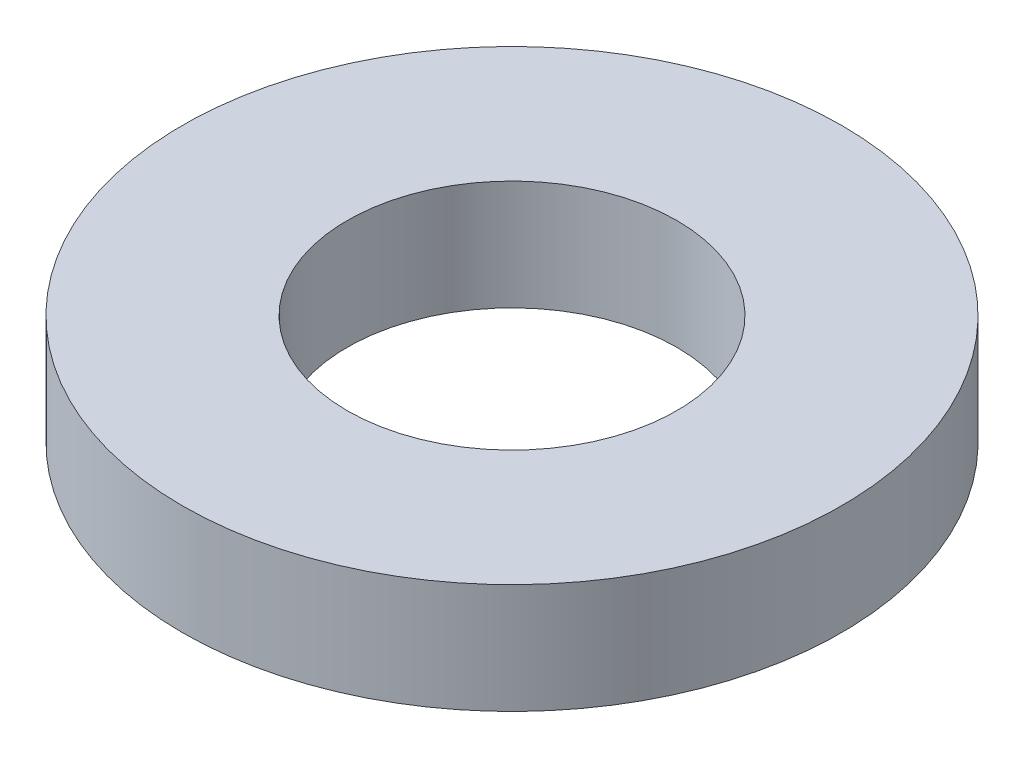
ISO-10303-21;
HEADER;
FILE_DESCRIPTION(('STEP AP214'),'2;1');
FILE_NAME('part.step','',(''),(''),'','','');
FILE_SCHEMA(('AUTOMOTIVE_DESIGN { 1 0 10303 214 1 1 1 1 }'));
ENDSEC;
DATA;
#1=APPLICATION_CONTEXT('core data for automotive mechanical design processes');
#2=APPLICATION_PROTOCOL_DEFINITION('international standard','automotive_design',2000,#1);
#3=PRODUCT_CONTEXT('',#1,'mechanical');
#4=PRODUCT('Part','Part','',(#3));
#5=PRODUCT_RELATED_PRODUCT_CATEGORY('part','',(#4));
#6=PRODUCT_DEFINITION_FORMATION('','',#4);
#7=PRODUCT_DEFINITION_CONTEXT('part definition',#1,'design');
#8=PRODUCT_DEFINITION('design','',#6,#7);
#9=PRODUCT_DEFINITION_SHAPE('','',#8);
#10=(LENGTH_UNIT() NAMED_UNIT(*) SI_UNIT(.MILLI.,.METRE.));
#11=(NAMED_UNIT(*) PLANE_ANGLE_UNIT() SI_UNIT($,.RADIAN.));
#12=(NAMED_UNIT(*) SI_UNIT($,.STERADIAN.) SOLID_ANGLE_UNIT());
#13=UNCERTAINTY_MEASURE_WITH_UNIT(LENGTH_MEASURE(1.E-05),#10,'distance_accuracy_value','');
#14=(GEOMETRIC_REPRESENTATION_CONTEXT(3) GLOBAL_UNCERTAINTY_ASSIGNED_CONTEXT((#13)) GLOBAL_UNIT_ASSIGNED_CONTEXT((#10,
#11,#12)) REPRESENTATION_CONTEXT('',''));
#15=CARTESIAN_POINT('',(0.,0.,0.));
#16=DIRECTION('',(0.,0.,1.));
#17=DIRECTION('',(1.,0.,0.));
#18=AXIS2_PLACEMENT_3D('',#15,#16,#17);
#19=CARTESIAN_POINT('',(0.,10.,0.));
#20=DIRECTION('',(0.,1.,0.));
#21=DIRECTION('',(0.,0.,1.));
#22=AXIS2_PLACEMENT_3D('',#19,#20,#21);
#23=PLANE('',#22);
#24=CARTESIAN_POINT('',(0.,10.,0.));
#25=DIRECTION('',(0.,1.,0.));
#26=DIRECTION('',(0.,0.,1.));
#27=AXIS2_PLACEMENT_3D('',#24,#25,#26);
#28=CIRCLE('',#27,30.);
#29=CARTESIAN_POINT('',(0.,10.,30.));
#30=VERTEX_POINT('',#29);
#31=EDGE_CURVE('E10',#30,#30,#28,.T.);
#32=ORIENTED_EDGE('',*,*,#31,.T.);
#33=EDGE_LOOP('',(#32));
#34=FACE_BOUND('',#33,.T.);
#35=CARTESIAN_POINT('',(0.,10.,0.));
#36=DIRECTION('',(0.,1.,0.));
#37=DIRECTION('',(0.,0.,1.));
#38=AXIS2_PLACEMENT_3D('',#35,#36,#37);
#39=CIRCLE('',#38,15.);
#40=CARTESIAN_POINT('',(0.,10.,15.));
#41=VERTEX_POINT('',#40);
#42=EDGE_CURVE('E42',#41,#41,#39,.T.);
#43=ORIENTED_EDGE('',*,*,#42,.F.);
#44=EDGE_LOOP('',(#43));
#45=FACE_BOUND('',#44,.T.);
#46=ADVANCED_FACE('F31',(#34,#45),#23,.T.);
#47=CARTESIAN_POINT('',(0.,0.,0.));
#48=DIRECTION('',(0.,1.,0.));
#49=DIRECTION('',(0.,0.,1.));
#50=AXIS2_PLACEMENT_3D('',#47,#48,#49);
#51=PLANE('',#50);
#52=CARTESIAN_POINT('',(0.,0.,0.));
#53=DIRECTION('',(0.,1.,0.));
#54=DIRECTION('',(0.,0.,1.));
#55=AXIS2_PLACEMENT_3D('',#52,#53,#54);
#56=CIRCLE('',#55,30.);
#57=CARTESIAN_POINT('',(0.,0.,30.));
#58=VERTEX_POINT('',#57);
#59=EDGE_CURVE('E35',#58,#58,#56,.T.);
#60=ORIENTED_EDGE('',*,*,#59,.F.);
#61=EDGE_LOOP('',(#60));
#62=FACE_BOUND('',#61,.T.);
#63=CARTESIAN_POINT('',(0.,0.,0.));
#64=DIRECTION('',(0.,1.,0.));
#65=DIRECTION('',(0.,0.,1.));
#66=AXIS2_PLACEMENT_3D('',#63,#64,#65);
#67=CIRCLE('',#66,15.);
#68=CARTESIAN_POINT('',(0.,0.,15.));
#69=VERTEX_POINT('',#68);
#70=EDGE_CURVE('E44',#69,#69,#67,.T.);
#71=ORIENTED_EDGE('',*,*,#70,.T.);
#72=EDGE_LOOP('',(#71));
#73=FACE_BOUND('',#72,.T.);
#74=ADVANCED_FACE('F54',(#62,#73),#51,.F.);
#75=CARTESIAN_POINT('',(0.,10.,0.));
#76=DIRECTION('',(0.,-1.,0.));
#77=DIRECTION('',(0.,0.,-1.));
#78=AXIS2_PLACEMENT_3D('',#75,#76,#77);
#79=CYLINDRICAL_SURFACE('',#78,30.);
#80=ORIENTED_EDGE('',*,*,#31,.F.);
#81=EDGE_LOOP('',(#80));
#82=FACE_BOUND('',#81,.T.);
#83=ORIENTED_EDGE('',*,*,#59,.T.);
#84=EDGE_LOOP('',(#83));
#85=FACE_BOUND('',#84,.T.);
#86=ADVANCED_FACE('F33',(#82,#85),#79,.T.);
#87=CARTESIAN_POINT('',(0.,10.,0.));
#88=DIRECTION('',(0.,-1.,0.));
#89=DIRECTION('',(0.,0.,-1.));
#90=AXIS2_PLACEMENT_3D('',#87,#88,#89);
#91=CYLINDRICAL_SURFACE('',#90,15.);
#92=ORIENTED_EDGE('',*,*,#42,.T.);
#93=EDGE_LOOP('',(#92));
#94=FACE_BOUND('',#93,.T.);
#95=ORIENTED_EDGE('',*,*,#70,.F.);
#96=EDGE_LOOP('',(#95));
#97=FACE_BOUND('',#96,.T.);
#98=ADVANCED_FACE('F50',(#94,#97),#91,.F.);
#99=CLOSED_SHELL('',(#46,#74,#86,#98));
#100=MANIFOLD_SOLID_BREP('B2',#99);
#101=ADVANCED_BREP_SHAPE_REPRESENTATION('',(#18,#100),#14);
#102=SHAPE_DEFINITION_REPRESENTATION(#9,#101);
ENDSEC;
END-ISO-10303-21;
